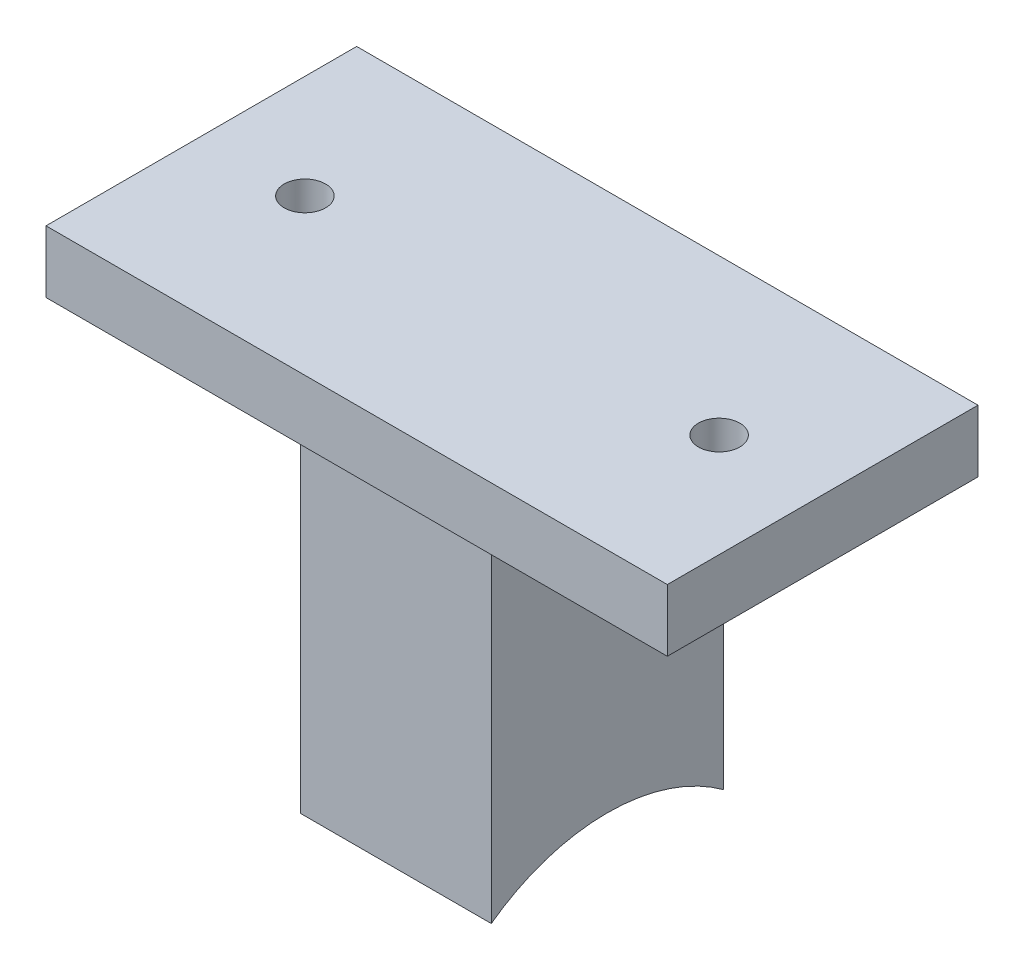
ISO-10303-21;
HEADER;
FILE_DESCRIPTION(('STEP AP214'),'2;1');
FILE_NAME('part.step','',(''),(''),'','','');
FILE_SCHEMA(('AUTOMOTIVE_DESIGN { 1 0 10303 214 1 1 1 1 }'));
ENDSEC;
DATA;
#1=APPLICATION_CONTEXT('core data for automotive mechanical design processes');
#2=APPLICATION_PROTOCOL_DEFINITION('international standard','automotive_design',2000,#1);
#3=PRODUCT_CONTEXT('',#1,'mechanical');
#4=PRODUCT('Part','Part','',(#3));
#5=PRODUCT_RELATED_PRODUCT_CATEGORY('part','',(#4));
#6=PRODUCT_DEFINITION_FORMATION('','',#4);
#7=PRODUCT_DEFINITION_CONTEXT('part definition',#1,'design');
#8=PRODUCT_DEFINITION('design','',#6,#7);
#9=PRODUCT_DEFINITION_SHAPE('','',#8);
#10=(LENGTH_UNIT() NAMED_UNIT(*) SI_UNIT(.MILLI.,.METRE.));
#11=(NAMED_UNIT(*) PLANE_ANGLE_UNIT() SI_UNIT($,.RADIAN.));
#12=(NAMED_UNIT(*) SI_UNIT($,.STERADIAN.) SOLID_ANGLE_UNIT());
#13=UNCERTAINTY_MEASURE_WITH_UNIT(LENGTH_MEASURE(1.E-05),#10,'distance_accuracy_value','');
#14=(GEOMETRIC_REPRESENTATION_CONTEXT(3) GLOBAL_UNCERTAINTY_ASSIGNED_CONTEXT((#13)) GLOBAL_UNIT_ASSIGNED_CONTEXT((#10,
#11,#12)) REPRESENTATION_CONTEXT('',''));
#15=CARTESIAN_POINT('',(0.,0.,0.));
#16=DIRECTION('',(0.,0.,1.));
#17=DIRECTION('',(1.,0.,0.));
#18=AXIS2_PLACEMENT_3D('',#15,#16,#17);
#19=CARTESIAN_POINT('',(15.,-25.,0.));
#20=DIRECTION('',(-1.,0.,0.));
#21=DIRECTION('',(0.,0.,1.));
#22=AXIS2_PLACEMENT_3D('',#19,#20,#21);
#23=CYLINDRICAL_SURFACE('',#22,9.5);
#24=CARTESIAN_POINT('',(-4.6,-25.,0.));
#25=DIRECTION('',(-1.,0.,0.));
#26=DIRECTION('',(0.,0.,1.));
#27=AXIS2_PLACEMENT_3D('',#24,#25,#26);
#28=CIRCLE('',#27,9.5);
#29=CARTESIAN_POINT('',(-4.6,-17.3260179828201,5.6));
#30=VERTEX_POINT('',#29);
#31=CARTESIAN_POINT('',(-4.6,-16.2931061795839,3.8));
#32=VERTEX_POINT('',#31);
#33=EDGE_CURVE('E169',#30,#32,#28,.T.);
#34=ORIENTED_EDGE('',*,*,#33,.T.);
#35=DIRECTION('',(-1.,0.,0.));
#36=VECTOR('',#35,1.);
#37=CARTESIAN_POINT('',(15.,-16.2931061795839,3.8));
#38=LINE('',#37,#36);
#39=CARTESIAN_POINT('',(4.6,-16.2931061795839,3.8));
#40=VERTEX_POINT('',#39);
#41=EDGE_CURVE('E60',#32,#40,#38,.F.);
#42=ORIENTED_EDGE('',*,*,#41,.T.);
#43=CARTESIAN_POINT('',(4.6,-25.,0.));
#44=DIRECTION('',(-1.,0.,0.));
#45=DIRECTION('',(0.,0.,1.));
#46=AXIS2_PLACEMENT_3D('',#43,#44,#45);
#47=CIRCLE('',#46,9.5);
#48=CARTESIAN_POINT('',(4.6,-17.3260179828201,5.6));
#49=VERTEX_POINT('',#48);
#50=EDGE_CURVE('E171',#49,#40,#47,.T.);
#51=ORIENTED_EDGE('',*,*,#50,.F.);
#52=DIRECTION('',(-1.,0.,0.));
#53=VECTOR('',#52,1.);
#54=CARTESIAN_POINT('',(15.,-17.3260179828201,5.6));
#55=LINE('',#54,#53);
#56=EDGE_CURVE('E167',#30,#49,#55,.F.);
#57=ORIENTED_EDGE('',*,*,#56,.F.);
#58=EDGE_LOOP('',(#34,#42,#51,#57));
#59=FACE_BOUND('',#58,.T.);
#60=ADVANCED_FACE('F39',(#59),#23,.F.);
#61=CARTESIAN_POINT('',(0.,0.,0.));
#62=DIRECTION('',(0.,-1.,0.));
#63=DIRECTION('',(0.,0.,-1.));
#64=AXIS2_PLACEMENT_3D('',#61,#62,#63);
#65=PLANE('',#64);
#66=DIRECTION('',(0.,0.,-1.));
#67=VECTOR('',#66,1.);
#68=CARTESIAN_POINT('',(-15.,0.,7.5));
#69=LINE('',#68,#67);
#70=CARTESIAN_POINT('',(-15.,0.,7.5));
#71=VERTEX_POINT('',#70);
#72=CARTESIAN_POINT('',(-15.,0.,-7.5));
#73=VERTEX_POINT('',#72);
#74=EDGE_CURVE('E224',#71,#73,#69,.T.);
#75=ORIENTED_EDGE('',*,*,#74,.T.);
#76=DIRECTION('',(1.,0.,0.));
#77=VECTOR('',#76,1.);
#78=CARTESIAN_POINT('',(-15.,0.,-7.5));
#79=LINE('',#78,#77);
#80=CARTESIAN_POINT('',(15.,0.,-7.5));
#81=VERTEX_POINT('',#80);
#82=EDGE_CURVE('E241',#73,#81,#79,.T.);
#83=ORIENTED_EDGE('',*,*,#82,.T.);
#84=DIRECTION('',(0.,0.,-1.));
#85=VECTOR('',#84,1.);
#86=CARTESIAN_POINT('',(15.,0.,7.5));
#87=LINE('',#86,#85);
#88=CARTESIAN_POINT('',(15.,0.,7.5));
#89=VERTEX_POINT('',#88);
#90=EDGE_CURVE('E244',#89,#81,#87,.T.);
#91=ORIENTED_EDGE('',*,*,#90,.F.);
#92=DIRECTION('',(1.,0.,0.));
#93=VECTOR('',#92,1.);
#94=CARTESIAN_POINT('',(-15.,0.,7.5));
#95=LINE('',#94,#93);
#96=EDGE_CURVE('E231',#71,#89,#95,.T.);
#97=ORIENTED_EDGE('',*,*,#96,.F.);
#98=EDGE_LOOP('',(#75,#83,#91,#97));
#99=FACE_BOUND('',#98,.T.);
#100=CARTESIAN_POINT('',(10.,0.,0.));
#101=DIRECTION('',(0.,-1.,0.));
#102=DIRECTION('',(0.,0.,-1.));
#103=AXIS2_PLACEMENT_3D('',#100,#101,#102);
#104=CIRCLE('',#103,1.5);
#105=CARTESIAN_POINT('',(10.,0.,-1.5));
#106=VERTEX_POINT('',#105);
#107=EDGE_CURVE('E216',#106,#106,#104,.T.);
#108=ORIENTED_EDGE('',*,*,#107,.F.);
#109=EDGE_LOOP('',(#108));
#110=FACE_BOUND('',#109,.T.);
#111=CARTESIAN_POINT('',(-10.,0.,0.));
#112=DIRECTION('',(0.,-1.,0.));
#113=DIRECTION('',(0.,0.,-1.));
#114=AXIS2_PLACEMENT_3D('',#111,#112,#113);
#115=CIRCLE('',#114,1.5);
#116=CARTESIAN_POINT('',(-10.,0.,-1.5));
#117=VERTEX_POINT('',#116);
#118=EDGE_CURVE('E206',#117,#117,#115,.T.);
#119=ORIENTED_EDGE('',*,*,#118,.F.);
#120=EDGE_LOOP('',(#119));
#121=FACE_BOUND('',#120,.T.);
#122=DIRECTION('',(1.,0.,0.));
#123=VECTOR('',#122,1.);
#124=CARTESIAN_POINT('',(-4.6,0.,-5.6));
#125=LINE('',#124,#123);
#126=CARTESIAN_POINT('',(-4.6,0.,-5.6));
#127=VERTEX_POINT('',#126);
#128=CARTESIAN_POINT('',(4.6,0.,-5.6));
#129=VERTEX_POINT('',#128);
#130=EDGE_CURVE('E466',#127,#129,#125,.T.);
#131=ORIENTED_EDGE('',*,*,#130,.F.);
#132=DIRECTION('',(0.,0.,-1.));
#133=VECTOR('',#132,1.);
#134=CARTESIAN_POINT('',(-4.6,0.,5.6));
#135=LINE('',#134,#133);
#136=CARTESIAN_POINT('',(-4.6,0.,5.6));
#137=VERTEX_POINT('',#136);
#138=EDGE_CURVE('E464',#137,#127,#135,.T.);
#139=ORIENTED_EDGE('',*,*,#138,.F.);
#140=DIRECTION('',(-1.,0.,0.));
#141=VECTOR('',#140,1.);
#142=CARTESIAN_POINT('',(-4.6,0.,5.6));
#143=LINE('',#142,#141);
#144=CARTESIAN_POINT('',(4.6,0.,5.6));
#145=VERTEX_POINT('',#144);
#146=EDGE_CURVE('E189',#145,#137,#143,.T.);
#147=ORIENTED_EDGE('',*,*,#146,.F.);
#148=DIRECTION('',(0.,0.,1.));
#149=VECTOR('',#148,1.);
#150=CARTESIAN_POINT('',(4.6,0.,5.6));
#151=LINE('',#150,#149);
#152=EDGE_CURVE('E195',#129,#145,#151,.T.);
#153=ORIENTED_EDGE('',*,*,#152,.F.);
#154=EDGE_LOOP('',(#131,#139,#147,#153));
#155=FACE_BOUND('',#154,.T.);
#156=ADVANCED_FACE('F393',(#99,#110,#121,#155),#65,.T.);
#157=CARTESIAN_POINT('',(10.,3.,0.));
#158=DIRECTION('',(0.,-1.,0.));
#159=DIRECTION('',(0.,0.,-1.));
#160=AXIS2_PLACEMENT_3D('',#157,#158,#159);
#161=CYLINDRICAL_SURFACE('',#160,1.);
#162=CARTESIAN_POINT('',(10.,3.,0.));
#163=DIRECTION('',(0.,-1.,0.));
#164=DIRECTION('',(0.,0.,-1.));
#165=AXIS2_PLACEMENT_3D('',#162,#163,#164);
#166=CIRCLE('',#165,1.);
#167=CARTESIAN_POINT('',(10.,3.,-0.999999999999998));
#168=VERTEX_POINT('',#167);
#169=EDGE_CURVE('E211',#168,#168,#166,.T.);
#170=ORIENTED_EDGE('',*,*,#169,.F.);
#171=EDGE_LOOP('',(#170));
#172=FACE_BOUND('',#171,.T.);
#173=CARTESIAN_POINT('',(10.,1.,0.));
#174=DIRECTION('',(0.,-1.,0.));
#175=DIRECTION('',(0.,0.,-1.));
#176=AXIS2_PLACEMENT_3D('',#173,#174,#175);
#177=CIRCLE('',#176,1.);
#178=CARTESIAN_POINT('',(10.,1.,-0.999999999999998));
#179=VERTEX_POINT('',#178);
#180=EDGE_CURVE('E202',#179,#179,#177,.T.);
#181=ORIENTED_EDGE('',*,*,#180,.T.);
#182=EDGE_LOOP('',(#181));
#183=FACE_BOUND('',#182,.T.);
#184=ADVANCED_FACE('F389',(#172,#183),#161,.F.);
#185=CARTESIAN_POINT('',(-10.,3.,0.));
#186=DIRECTION('',(0.,-1.,0.));
#187=DIRECTION('',(0.,0.,-1.));
#188=AXIS2_PLACEMENT_3D('',#185,#186,#187);
#189=CYLINDRICAL_SURFACE('',#188,1.);
#190=CARTESIAN_POINT('',(-10.,3.,0.));
#191=DIRECTION('',(0.,-1.,0.));
#192=DIRECTION('',(0.,0.,-1.));
#193=AXIS2_PLACEMENT_3D('',#190,#191,#192);
#194=CIRCLE('',#193,1.);
#195=CARTESIAN_POINT('',(-10.,3.,-1.));
#196=VERTEX_POINT('',#195);
#197=EDGE_CURVE('E221',#196,#196,#194,.T.);
#198=ORIENTED_EDGE('',*,*,#197,.F.);
#199=EDGE_LOOP('',(#198));
#200=FACE_BOUND('',#199,.T.);
#201=CARTESIAN_POINT('',(-10.,1.,0.));
#202=DIRECTION('',(0.,-1.,0.));
#203=DIRECTION('',(0.,0.,-1.));
#204=AXIS2_PLACEMENT_3D('',#201,#202,#203);
#205=CIRCLE('',#204,1.);
#206=CARTESIAN_POINT('',(-10.,1.,-1.));
#207=VERTEX_POINT('',#206);
#208=EDGE_CURVE('E203',#207,#207,#205,.T.);
#209=ORIENTED_EDGE('',*,*,#208,.T.);
#210=EDGE_LOOP('',(#209));
#211=FACE_BOUND('',#210,.T.);
#212=ADVANCED_FACE('F385',(#200,#211),#189,.F.);
#213=CARTESIAN_POINT('',(-15.,3.,7.5));
#214=DIRECTION('',(-1.,0.,0.));
#215=DIRECTION('',(0.,0.,1.));
#216=AXIS2_PLACEMENT_3D('',#213,#214,#215);
#217=PLANE('',#216);
#218=ORIENTED_EDGE('',*,*,#74,.F.);
#219=DIRECTION('',(0.,-1.,0.));
#220=VECTOR('',#219,1.);
#221=CARTESIAN_POINT('',(-15.,3.,7.5));
#222=LINE('',#221,#220);
#223=CARTESIAN_POINT('',(-15.,3.,7.5));
#224=VERTEX_POINT('',#223);
#225=EDGE_CURVE('E248',#224,#71,#222,.T.);
#226=ORIENTED_EDGE('',*,*,#225,.F.);
#227=DIRECTION('',(0.,0.,-1.));
#228=VECTOR('',#227,1.);
#229=CARTESIAN_POINT('',(-15.,3.,7.5));
#230=LINE('',#229,#228);
#231=CARTESIAN_POINT('',(-15.,3.,-7.5));
#232=VERTEX_POINT('',#231);
#233=EDGE_CURVE('E227',#224,#232,#230,.T.);
#234=ORIENTED_EDGE('',*,*,#233,.T.);
#235=DIRECTION('',(0.,-1.,0.));
#236=VECTOR('',#235,1.);
#237=CARTESIAN_POINT('',(-15.,3.,-7.5));
#238=LINE('',#237,#236);
#239=EDGE_CURVE('E238',#232,#73,#238,.T.);
#240=ORIENTED_EDGE('',*,*,#239,.T.);
#241=EDGE_LOOP('',(#218,#226,#234,#240));
#242=FACE_BOUND('',#241,.T.);
#243=ADVANCED_FACE('F388',(#242),#217,.T.);
#244=CARTESIAN_POINT('',(-15.,3.,7.5));
#245=DIRECTION('',(0.,0.,-1.));
#246=DIRECTION('',(-1.,0.,0.));
#247=AXIS2_PLACEMENT_3D('',#244,#245,#246);
#248=PLANE('',#247);
#249=ORIENTED_EDGE('',*,*,#96,.T.);
#250=DIRECTION('',(0.,-1.,0.));
#251=VECTOR('',#250,1.);
#252=CARTESIAN_POINT('',(15.,3.,7.5));
#253=LINE('',#252,#251);
#254=CARTESIAN_POINT('',(15.,3.,7.5));
#255=VERTEX_POINT('',#254);
#256=EDGE_CURVE('E250',#255,#89,#253,.T.);
#257=ORIENTED_EDGE('',*,*,#256,.F.);
#258=DIRECTION('',(1.,0.,0.));
#259=VECTOR('',#258,1.);
#260=CARTESIAN_POINT('',(-15.,3.,7.5));
#261=LINE('',#260,#259);
#262=EDGE_CURVE('E236',#224,#255,#261,.T.);
#263=ORIENTED_EDGE('',*,*,#262,.F.);
#264=ORIENTED_EDGE('',*,*,#225,.T.);
#265=EDGE_LOOP('',(#249,#257,#263,#264));
#266=FACE_BOUND('',#265,.T.);
#267=ADVANCED_FACE('F402',(#266),#248,.F.);
#268=CARTESIAN_POINT('',(15.,3.,7.5));
#269=DIRECTION('',(-1.,0.,0.));
#270=DIRECTION('',(0.,0.,1.));
#271=AXIS2_PLACEMENT_3D('',#268,#269,#270);
#272=PLANE('',#271);
#273=ORIENTED_EDGE('',*,*,#90,.T.);
#274=DIRECTION('',(0.,-1.,0.));
#275=VECTOR('',#274,1.);
#276=CARTESIAN_POINT('',(15.,3.,-7.5));
#277=LINE('',#276,#275);
#278=CARTESIAN_POINT('',(15.,3.,-7.5));
#279=VERTEX_POINT('',#278);
#280=EDGE_CURVE('E253',#279,#81,#277,.T.);
#281=ORIENTED_EDGE('',*,*,#280,.F.);
#282=DIRECTION('',(0.,0.,-1.));
#283=VECTOR('',#282,1.);
#284=CARTESIAN_POINT('',(15.,3.,7.5));
#285=LINE('',#284,#283);
#286=EDGE_CURVE('E234',#255,#279,#285,.T.);
#287=ORIENTED_EDGE('',*,*,#286,.F.);
#288=ORIENTED_EDGE('',*,*,#256,.T.);
#289=EDGE_LOOP('',(#273,#281,#287,#288));
#290=FACE_BOUND('',#289,.T.);
#291=ADVANCED_FACE('F405',(#290),#272,.F.);
#292=CARTESIAN_POINT('',(-15.,3.,-7.5));
#293=DIRECTION('',(0.,0.,-1.));
#294=DIRECTION('',(-1.,0.,0.));
#295=AXIS2_PLACEMENT_3D('',#292,#293,#294);
#296=PLANE('',#295);
#297=ORIENTED_EDGE('',*,*,#82,.F.);
#298=ORIENTED_EDGE('',*,*,#239,.F.);
#299=DIRECTION('',(1.,0.,0.));
#300=VECTOR('',#299,1.);
#301=CARTESIAN_POINT('',(-15.,3.,-7.5));
#302=LINE('',#301,#300);
#303=EDGE_CURVE('E230',#232,#279,#302,.T.);
#304=ORIENTED_EDGE('',*,*,#303,.T.);
#305=ORIENTED_EDGE('',*,*,#280,.T.);
#306=EDGE_LOOP('',(#297,#298,#304,#305));
#307=FACE_BOUND('',#306,.T.);
#308=ADVANCED_FACE('F397',(#307),#296,.T.);
#309=CARTESIAN_POINT('',(0.,3.,0.));
#310=DIRECTION('',(0.,-1.,0.));
#311=DIRECTION('',(0.,0.,-1.));
#312=AXIS2_PLACEMENT_3D('',#309,#310,#311);
#313=PLANE('',#312);
#314=ORIENTED_EDGE('',*,*,#197,.T.);
#315=EDGE_LOOP('',(#314));
#316=FACE_BOUND('',#315,.T.);
#317=ORIENTED_EDGE('',*,*,#169,.T.);
#318=EDGE_LOOP('',(#317));
#319=FACE_BOUND('',#318,.T.);
#320=ORIENTED_EDGE('',*,*,#233,.F.);
#321=ORIENTED_EDGE('',*,*,#262,.T.);
#322=ORIENTED_EDGE('',*,*,#286,.T.);
#323=ORIENTED_EDGE('',*,*,#303,.F.);
#324=EDGE_LOOP('',(#320,#321,#322,#323));
#325=FACE_BOUND('',#324,.T.);
#326=ADVANCED_FACE('F377',(#316,#319,#325),#313,.F.);
#327=CARTESIAN_POINT('',(-10.,1.,0.));
#328=DIRECTION('',(0.,-1.,0.));
#329=DIRECTION('',(0.,0.,-1.));
#330=AXIS2_PLACEMENT_3D('',#327,#328,#329);
#331=CYLINDRICAL_SURFACE('',#330,1.5);
#332=CARTESIAN_POINT('',(-10.,1.,0.));
#333=DIRECTION('',(0.,-1.,0.));
#334=DIRECTION('',(0.,0.,-1.));
#335=AXIS2_PLACEMENT_3D('',#332,#333,#334);
#336=CIRCLE('',#335,1.5);
#337=CARTESIAN_POINT('',(-10.,1.,-1.5));
#338=VERTEX_POINT('',#337);
#339=EDGE_CURVE('E208',#338,#338,#336,.T.);
#340=ORIENTED_EDGE('',*,*,#339,.F.);
#341=EDGE_LOOP('',(#340));
#342=FACE_BOUND('',#341,.T.);
#343=ORIENTED_EDGE('',*,*,#118,.T.);
#344=EDGE_LOOP('',(#343));
#345=FACE_BOUND('',#344,.T.);
#346=ADVANCED_FACE('F373',(#342,#345),#331,.F.);
#347=CARTESIAN_POINT('',(-10.,1.,0.));
#348=DIRECTION('',(0.,-1.,0.));
#349=DIRECTION('',(0.,0.,-1.));
#350=AXIS2_PLACEMENT_3D('',#347,#348,#349);
#351=PLANE('',#350);
#352=ORIENTED_EDGE('',*,*,#208,.F.);
#353=EDGE_LOOP('',(#352));
#354=FACE_BOUND('',#353,.T.);
#355=ORIENTED_EDGE('',*,*,#339,.T.);
#356=EDGE_LOOP('',(#355));
#357=FACE_BOUND('',#356,.T.);
#358=ADVANCED_FACE('F369',(#354,#357),#351,.T.);
#359=CARTESIAN_POINT('',(10.,1.,0.));
#360=DIRECTION('',(0.,-1.,0.));
#361=DIRECTION('',(0.,0.,-1.));
#362=AXIS2_PLACEMENT_3D('',#359,#360,#361);
#363=CYLINDRICAL_SURFACE('',#362,1.5);
#364=CARTESIAN_POINT('',(10.,1.,0.));
#365=DIRECTION('',(0.,-1.,0.));
#366=DIRECTION('',(0.,0.,-1.));
#367=AXIS2_PLACEMENT_3D('',#364,#365,#366);
#368=CIRCLE('',#367,1.5);
#369=CARTESIAN_POINT('',(10.,1.,-1.5));
#370=VERTEX_POINT('',#369);
#371=EDGE_CURVE('E207',#370,#370,#368,.T.);
#372=ORIENTED_EDGE('',*,*,#371,.F.);
#373=EDGE_LOOP('',(#372));
#374=FACE_BOUND('',#373,.T.);
#375=ORIENTED_EDGE('',*,*,#107,.T.);
#376=EDGE_LOOP('',(#375));
#377=FACE_BOUND('',#376,.T.);
#378=ADVANCED_FACE('F372',(#374,#377),#363,.F.);
#379=CARTESIAN_POINT('',(10.,1.,0.));
#380=DIRECTION('',(0.,-1.,0.));
#381=DIRECTION('',(0.,0.,-1.));
#382=AXIS2_PLACEMENT_3D('',#379,#380,#381);
#383=PLANE('',#382);
#384=ORIENTED_EDGE('',*,*,#180,.F.);
#385=EDGE_LOOP('',(#384));
#386=FACE_BOUND('',#385,.T.);
#387=ORIENTED_EDGE('',*,*,#371,.T.);
#388=EDGE_LOOP('',(#387));
#389=FACE_BOUND('',#388,.T.);
#390=ADVANCED_FACE('F368',(#386,#389),#383,.T.);
#391=CARTESIAN_POINT('',(-4.6,-20.,5.6));
#392=DIRECTION('',(1.,0.,0.));
#393=DIRECTION('',(0.,0.,-1.));
#394=AXIS2_PLACEMENT_3D('',#391,#392,#393);
#395=PLANE('',#394);
#396=CARTESIAN_POINT('',(-4.6,-25.,0.));
#397=DIRECTION('',(1.,0.,0.));
#398=DIRECTION('',(0.,0.,-1.));
#399=AXIS2_PLACEMENT_3D('',#396,#397,#398);
#400=CIRCLE('',#399,9.50250156445618);
#401=CARTESIAN_POINT('',(-4.60000000001913,-16.2548518419634,-3.71751525571356));
#402=VERTEX_POINT('',#401);
#403=CARTESIAN_POINT('',(-4.6,-16.2548518419625,3.71751525571391));
#404=VERTEX_POINT('',#403);
#405=EDGE_CURVE('E265',#402,#404,#400,.T.);
#406=ORIENTED_EDGE('',*,*,#405,.T.);
#407=CARTESIAN_POINT('',(-4.6,-14.4600759016016,4.6));
#408=DIRECTION('',(1.,0.,0.));
#409=DIRECTION('',(0.,0.,-1.));
#410=AXIS2_PLACEMENT_3D('',#407,#408,#409);
#411=CIRCLE('',#410,2.);
#412=EDGE_CURVE('E184',#404,#32,#411,.F.);
#413=ORIENTED_EDGE('',*,*,#412,.T.);
#414=ORIENTED_EDGE('',*,*,#33,.F.);
#415=DIRECTION('',(0.,1.,0.));
#416=VECTOR('',#415,1.);
#417=CARTESIAN_POINT('',(-4.6,-20.,5.6));
#418=LINE('',#417,#416);
#419=EDGE_CURVE('E182',#30,#137,#418,.T.);
#420=ORIENTED_EDGE('',*,*,#419,.T.);
#421=ORIENTED_EDGE('',*,*,#138,.T.);
#422=DIRECTION('',(0.,1.,0.));
#423=VECTOR('',#422,1.);
#424=CARTESIAN_POINT('',(-4.6,-20.,-5.6));
#425=LINE('',#424,#423);
#426=CARTESIAN_POINT('',(-4.6,-17.3260179828201,-5.6));
#427=VERTEX_POINT('',#426);
#428=EDGE_CURVE('E200',#427,#127,#425,.T.);
#429=ORIENTED_EDGE('',*,*,#428,.F.);
#430=CARTESIAN_POINT('',(-4.6,-16.2931061795839,-3.8));
#431=VERTEX_POINT('',#430);
#432=EDGE_CURVE('E185',#431,#427,#28,.T.);
#433=ORIENTED_EDGE('',*,*,#432,.F.);
#434=CARTESIAN_POINT('',(-4.6,-14.4600759016016,-4.6));
#435=DIRECTION('',(1.,0.,0.));
#436=DIRECTION('',(0.,0.,-1.));
#437=AXIS2_PLACEMENT_3D('',#434,#435,#436);
#438=CIRCLE('',#437,2.);
#439=EDGE_CURVE('E262',#431,#402,#438,.F.);
#440=ORIENTED_EDGE('',*,*,#439,.T.);
#441=EDGE_LOOP('',(#406,#413,#414,#420,#421,#429,#433,#440));
#442=FACE_BOUND('',#441,.T.);
#443=ADVANCED_FACE('F180',(#442),#395,.F.);
#444=CARTESIAN_POINT('',(-4.6,-20.,-5.6));
#445=DIRECTION('',(0.,0.,1.));
#446=DIRECTION('',(1.,0.,0.));
#447=AXIS2_PLACEMENT_3D('',#444,#445,#446);
#448=PLANE('',#447);
#449=DIRECTION('',(0.,1.,0.));
#450=VECTOR('',#449,1.);
#451=CARTESIAN_POINT('',(4.6,-20.,-5.6));
#452=LINE('',#451,#450);
#453=CARTESIAN_POINT('',(4.6,-17.3260179828201,-5.6));
#454=VERTEX_POINT('',#453);
#455=EDGE_CURVE('E193',#454,#129,#452,.T.);
#456=ORIENTED_EDGE('',*,*,#455,.F.);
#457=DIRECTION('',(-1.,0.,0.));
#458=VECTOR('',#457,1.);
#459=CARTESIAN_POINT('',(15.,-17.3260179828201,-5.6));
#460=LINE('',#459,#458);
#461=EDGE_CURVE('E442',#454,#427,#460,.T.);
#462=ORIENTED_EDGE('',*,*,#461,.T.);
#463=ORIENTED_EDGE('',*,*,#428,.T.);
#464=ORIENTED_EDGE('',*,*,#130,.T.);
#465=EDGE_LOOP('',(#456,#462,#463,#464));
#466=FACE_BOUND('',#465,.T.);
#467=ADVANCED_FACE('F361',(#466),#448,.F.);
#468=CARTESIAN_POINT('',(4.6,-20.,5.6));
#469=DIRECTION('',(-1.,0.,0.));
#470=DIRECTION('',(0.,0.,1.));
#471=AXIS2_PLACEMENT_3D('',#468,#469,#470);
#472=PLANE('',#471);
#473=CARTESIAN_POINT('',(4.6,-25.,0.));
#474=DIRECTION('',(-1.,0.,0.));
#475=DIRECTION('',(0.,0.,1.));
#476=AXIS2_PLACEMENT_3D('',#473,#474,#475);
#477=CIRCLE('',#476,9.50250156445618);
#478=CARTESIAN_POINT('',(4.60000000001911,-16.2548518419634,3.71751525571355));
#479=VERTEX_POINT('',#478);
#480=CARTESIAN_POINT('',(4.6,-16.2548518419625,-3.71751525571399));
#481=VERTEX_POINT('',#480);
#482=EDGE_CURVE('E274',#479,#481,#477,.T.);
#483=ORIENTED_EDGE('',*,*,#482,.T.);
#484=CARTESIAN_POINT('',(4.6,-14.4600759016016,-4.6));
#485=DIRECTION('',(-1.,0.,0.));
#486=DIRECTION('',(0.,0.,1.));
#487=AXIS2_PLACEMENT_3D('',#484,#485,#486);
#488=CIRCLE('',#487,2.);
#489=CARTESIAN_POINT('',(4.6,-16.2931061795839,-3.8));
#490=VERTEX_POINT('',#489);
#491=EDGE_CURVE('E277',#481,#490,#488,.F.);
#492=ORIENTED_EDGE('',*,*,#491,.T.);
#493=EDGE_CURVE('E175',#490,#454,#47,.T.);
#494=ORIENTED_EDGE('',*,*,#493,.T.);
#495=ORIENTED_EDGE('',*,*,#455,.T.);
#496=ORIENTED_EDGE('',*,*,#152,.T.);
#497=DIRECTION('',(0.,1.,0.));
#498=VECTOR('',#497,1.);
#499=CARTESIAN_POINT('',(4.6,-20.,5.6));
#500=LINE('',#499,#498);
#501=EDGE_CURVE('E191',#49,#145,#500,.T.);
#502=ORIENTED_EDGE('',*,*,#501,.F.);
#503=ORIENTED_EDGE('',*,*,#50,.T.);
#504=CARTESIAN_POINT('',(4.6,-14.4600759016016,4.6));
#505=DIRECTION('',(-1.,0.,0.));
#506=DIRECTION('',(0.,0.,1.));
#507=AXIS2_PLACEMENT_3D('',#504,#505,#506);
#508=CIRCLE('',#507,2.);
#509=EDGE_CURVE('E271',#40,#479,#508,.F.);
#510=ORIENTED_EDGE('',*,*,#509,.T.);
#511=EDGE_LOOP('',(#483,#492,#494,#495,#496,#502,#503,#510));
#512=FACE_BOUND('',#511,.T.);
#513=ADVANCED_FACE('F358',(#512),#472,.F.);
#514=CARTESIAN_POINT('',(-4.6,-20.,5.6));
#515=DIRECTION('',(0.,0.,-1.));
#516=DIRECTION('',(-1.,0.,0.));
#517=AXIS2_PLACEMENT_3D('',#514,#515,#516);
#518=PLANE('',#517);
#519=ORIENTED_EDGE('',*,*,#419,.F.);
#520=ORIENTED_EDGE('',*,*,#56,.T.);
#521=ORIENTED_EDGE('',*,*,#501,.T.);
#522=ORIENTED_EDGE('',*,*,#146,.T.);
#523=EDGE_LOOP('',(#519,#520,#521,#522));
#524=FACE_BOUND('',#523,.T.);
#525=ADVANCED_FACE('F187',(#524),#518,.F.);
#526=DIRECTION('',(-1.,0.,0.));
#527=VECTOR('',#526,1.);
#528=CARTESIAN_POINT('',(15.,-16.2931061795839,-3.8));
#529=LINE('',#528,#527);
#530=EDGE_CURVE('E257',#490,#431,#529,.T.);
#531=ORIENTED_EDGE('',*,*,#530,.T.);
#532=ORIENTED_EDGE('',*,*,#432,.T.);
#533=ORIENTED_EDGE('',*,*,#461,.F.);
#534=ORIENTED_EDGE('',*,*,#493,.F.);
#535=EDGE_LOOP('',(#531,#532,#533,#534));
#536=FACE_BOUND('',#535,.T.);
#537=ADVANCED_FACE('F328',(#536),#23,.F.);
#538=DIRECTION('',(0.,0.,1.));
#539=VECTOR('',#538,1.);
#540=CARTESIAN_POINT('',(2.7,0.,-2.6));
#541=LINE('',#540,#539);
#542=CARTESIAN_POINT('',(2.7,0.,-2.6));
#543=VERTEX_POINT('',#542);
#544=CARTESIAN_POINT('',(2.7,0.,2.6));
#545=VERTEX_POINT('',#544);
#546=EDGE_CURVE('E444',#543,#545,#541,.T.);
#547=ORIENTED_EDGE('',*,*,#546,.T.);
#548=DIRECTION('',(-1.,0.,0.));
#549=VECTOR('',#548,1.);
#550=CARTESIAN_POINT('',(-2.7,0.,2.6));
#551=LINE('',#550,#549);
#552=CARTESIAN_POINT('',(-2.7,0.,2.6));
#553=VERTEX_POINT('',#552);
#554=EDGE_CURVE('E447',#545,#553,#551,.T.);
#555=ORIENTED_EDGE('',*,*,#554,.T.);
#556=DIRECTION('',(0.,0.,-1.));
#557=VECTOR('',#556,1.);
#558=CARTESIAN_POINT('',(-2.7,0.,-2.6));
#559=LINE('',#558,#557);
#560=CARTESIAN_POINT('',(-2.7,0.,-2.6));
#561=VERTEX_POINT('',#560);
#562=EDGE_CURVE('E450',#553,#561,#559,.T.);
#563=ORIENTED_EDGE('',*,*,#562,.T.);
#564=DIRECTION('',(1.,0.,0.));
#565=VECTOR('',#564,1.);
#566=CARTESIAN_POINT('',(-2.7,0.,-2.6));
#567=LINE('',#566,#565);
#568=EDGE_CURVE('E453',#561,#543,#567,.T.);
#569=ORIENTED_EDGE('',*,*,#568,.T.);
#570=EDGE_LOOP('',(#547,#555,#563,#569));
#571=FACE_BOUND('',#570,.T.);
#572=ADVANCED_FACE('F326',(#571),#65,.T.);
#573=CARTESIAN_POINT('',(-2.7,-20.,-2.6));
#574=DIRECTION('',(0.,0.,1.));
#575=DIRECTION('',(1.,0.,0.));
#576=AXIS2_PLACEMENT_3D('',#573,#574,#575);
#577=PLANE('',#576);
#578=DIRECTION('',(0.,1.,0.));
#579=VECTOR('',#578,1.);
#580=CARTESIAN_POINT('',(-2.7,-20.,-2.6));
#581=LINE('',#580,#579);
#582=CARTESIAN_POINT('',(-2.7,-13.7977680795299,-2.6));
#583=VERTEX_POINT('',#582);
#584=EDGE_CURVE('E458',#583,#561,#581,.T.);
#585=ORIENTED_EDGE('',*,*,#584,.F.);
#586=CARTESIAN_POINT('',(-2.7,-13.7977680795299,-2.6));
#587=CARTESIAN_POINT('',(-2.69999600804059,-13.8540870609309,-2.6));
#588=CARTESIAN_POINT('',(-2.7022572607373,-13.9104047505056,-2.6));
#589=CARTESIAN_POINT('',(-2.71124096611712,-14.0223253673724,-2.6));
#590=CARTESIAN_POINT('',(-2.71793516824398,-14.0779305624729,-2.6));
#591=CARTESIAN_POINT('',(-2.73571644315342,-14.1884327831449,-2.6));
#592=CARTESIAN_POINT('',(-2.74680341961077,-14.2433298242178,-2.6));
#593=CARTESIAN_POINT('',(-2.77338010604683,-14.3524172190988,-2.6));
#594=CARTESIAN_POINT('',(-2.78889733598649,-14.4066008686753,-2.6));
#595=CARTESIAN_POINT('',(-2.80656352678688,-14.4600759016016,-2.6));
#596=B_SPLINE_CURVE_WITH_KNOTS('',3,(#586,#587,#588,#589,#590,#591,#592,#593,#594,#595),
.UNSPECIFIED.,.F.,.F.,(4,2,2,2,4),(0.,0.168909618063766,0.336753027055376,0.504592755762712,
0.673498647081827),.UNSPECIFIED.);
#597=CARTESIAN_POINT('',(-2.80656352678687,-14.4600759016016,-2.6));
#598=VERTEX_POINT('',#597);
#599=EDGE_CURVE('E307',#583,#598,#596,.T.);
#600=ORIENTED_EDGE('',*,*,#599,.T.);
#601=DIRECTION('',(1.,0.,0.));
#602=VECTOR('',#601,1.);
#603=CARTESIAN_POINT('',(2.7,-14.4600759016016,-2.6));
#604=LINE('',#603,#602);
#605=CARTESIAN_POINT('',(2.80656352678687,-14.4600759016016,-2.6));
#606=VERTEX_POINT('',#605);
#607=EDGE_CURVE('E259',#598,#606,#604,.T.);
#608=ORIENTED_EDGE('',*,*,#607,.T.);
#609=CARTESIAN_POINT('',(2.80656352678687,-14.4600759016016,-2.6));
#610=CARTESIAN_POINT('',(2.78889733598649,-14.4066008686753,-2.6));
#611=CARTESIAN_POINT('',(2.77338010604682,-14.3524172190988,-2.6));
#612=CARTESIAN_POINT('',(2.74680341961078,-14.2433298242178,-2.6));
#613=CARTESIAN_POINT('',(2.73571644315342,-14.1884327831449,-2.6));
#614=CARTESIAN_POINT('',(2.71793516824398,-14.0779305624729,-2.6));
#615=CARTESIAN_POINT('',(2.71124096611712,-14.0223253673724,-2.6));
#616=CARTESIAN_POINT('',(2.7022572607373,-13.9104047505056,-2.6));
#617=CARTESIAN_POINT('',(2.69999600804059,-13.8540870609309,-2.6));
#618=CARTESIAN_POINT('',(2.7,-13.7977680795299,-2.6));
#619=B_SPLINE_CURVE_WITH_KNOTS('',3,(#609,#610,#611,#612,#613,#614,#615,#616,#617,#618),
.UNSPECIFIED.,.F.,.F.,(4,2,2,2,4),(0.,0.168905891319114,0.336745620026447,0.504589029018059,
0.673498647081822),.UNSPECIFIED.);
#620=CARTESIAN_POINT('',(2.7,-13.7977680795299,-2.6));
#621=VERTEX_POINT('',#620);
#622=EDGE_CURVE('E331',#606,#621,#619,.T.);
#623=ORIENTED_EDGE('',*,*,#622,.T.);
#624=DIRECTION('',(0.,1.,0.));
#625=VECTOR('',#624,1.);
#626=CARTESIAN_POINT('',(2.7,-20.,-2.6));
#627=LINE('',#626,#625);
#628=EDGE_CURVE('E456',#621,#543,#627,.T.);
#629=ORIENTED_EDGE('',*,*,#628,.T.);
#630=ORIENTED_EDGE('',*,*,#568,.F.);
#631=EDGE_LOOP('',(#585,#600,#608,#623,#629,#630));
#632=FACE_BOUND('',#631,.T.);
#633=ADVANCED_FACE('F320',(#632),#577,.T.);
#634=CARTESIAN_POINT('',(-2.7,-20.,-2.6));
#635=DIRECTION('',(1.,0.,0.));
#636=DIRECTION('',(0.,0.,-1.));
#637=AXIS2_PLACEMENT_3D('',#634,#635,#636);
#638=PLANE('',#637);
#639=DIRECTION('',(0.,1.,0.));
#640=VECTOR('',#639,1.);
#641=CARTESIAN_POINT('',(-2.7,-20.,2.6));
#642=LINE('',#641,#640);
#643=CARTESIAN_POINT('',(-2.7,-13.7977680795299,2.6));
#644=VERTEX_POINT('',#643);
#645=EDGE_CURVE('E460',#644,#553,#642,.T.);
#646=ORIENTED_EDGE('',*,*,#645,.F.);
#647=CARTESIAN_POINT('',(-2.7,-25.,0.));
#648=DIRECTION('',(1.,0.,0.));
#649=DIRECTION('',(0.,0.,-1.));
#650=AXIS2_PLACEMENT_3D('',#647,#648,#649);
#651=CIRCLE('',#650,11.5);
#652=EDGE_CURVE('E268',#644,#583,#651,.F.);
#653=ORIENTED_EDGE('',*,*,#652,.T.);
#654=ORIENTED_EDGE('',*,*,#584,.T.);
#655=ORIENTED_EDGE('',*,*,#562,.F.);
#656=EDGE_LOOP('',(#646,#653,#654,#655));
#657=FACE_BOUND('',#656,.T.);
#658=ADVANCED_FACE('F325',(#657),#638,.T.);
#659=CARTESIAN_POINT('',(-2.7,-20.,2.6));
#660=DIRECTION('',(0.,0.,-1.));
#661=DIRECTION('',(-1.,0.,0.));
#662=AXIS2_PLACEMENT_3D('',#659,#660,#661);
#663=PLANE('',#662);
#664=DIRECTION('',(0.,1.,0.));
#665=VECTOR('',#664,1.);
#666=CARTESIAN_POINT('',(2.7,-20.,2.6));
#667=LINE('',#666,#665);
#668=CARTESIAN_POINT('',(2.7,-13.7977680795299,2.6));
#669=VERTEX_POINT('',#668);
#670=EDGE_CURVE('E462',#669,#545,#667,.T.);
#671=ORIENTED_EDGE('',*,*,#670,.F.);
#672=CARTESIAN_POINT('',(2.7,-13.7977680795299,2.6));
#673=CARTESIAN_POINT('',(2.69999600804059,-13.8540870609309,2.6));
#674=CARTESIAN_POINT('',(2.7022572607373,-13.9104047505056,2.6));
#675=CARTESIAN_POINT('',(2.71124096611712,-14.0223253673724,2.6));
#676=CARTESIAN_POINT('',(2.71793516824398,-14.0779305624729,2.6));
#677=CARTESIAN_POINT('',(2.73571644315342,-14.1884327831449,2.6));
#678=CARTESIAN_POINT('',(2.74680341961078,-14.2433298242178,2.6));
#679=CARTESIAN_POINT('',(2.77338010604683,-14.3524172190988,2.6));
#680=CARTESIAN_POINT('',(2.7888973359865,-14.4066008686753,2.6));
#681=CARTESIAN_POINT('',(2.80656352678689,-14.4600759016016,2.6));
#682=B_SPLINE_CURVE_WITH_KNOTS('',3,(#672,#673,#674,#675,#676,#677,#678,#679,#680,#681),
.UNSPECIFIED.,.F.,.F.,(4,2,2,2,4),(0.,0.168909618063766,0.336753027055376,0.50459275576271,
0.673498647081829),.UNSPECIFIED.);
#683=CARTESIAN_POINT('',(2.80656352678687,-14.4600759016016,2.6));
#684=VERTEX_POINT('',#683);
#685=EDGE_CURVE('E53',#669,#684,#682,.T.);
#686=ORIENTED_EDGE('',*,*,#685,.T.);
#687=DIRECTION('',(1.,0.,0.));
#688=VECTOR('',#687,1.);
#689=CARTESIAN_POINT('',(-2.7,-14.4600759016016,2.6));
#690=LINE('',#689,#688);
#691=CARTESIAN_POINT('',(-2.80656352678687,-14.4600759016016,2.6));
#692=VERTEX_POINT('',#691);
#693=EDGE_CURVE('E67',#684,#692,#690,.F.);
#694=ORIENTED_EDGE('',*,*,#693,.T.);
#695=CARTESIAN_POINT('',(-2.80656352678687,-14.4600759016016,2.6));
#696=CARTESIAN_POINT('',(-2.78889733598649,-14.4066008686753,2.6));
#697=CARTESIAN_POINT('',(-2.77338010604682,-14.3524172190988,2.6));
#698=CARTESIAN_POINT('',(-2.74680341961078,-14.2433298242178,2.6));
#699=CARTESIAN_POINT('',(-2.73571644315342,-14.1884327831449,2.6));
#700=CARTESIAN_POINT('',(-2.71793516824398,-14.0779305624729,2.6));
#701=CARTESIAN_POINT('',(-2.71124096611712,-14.0223253673724,2.6));
#702=CARTESIAN_POINT('',(-2.7022572607373,-13.9104047505056,2.6));
#703=CARTESIAN_POINT('',(-2.69999600804059,-13.8540870609309,2.6));
#704=CARTESIAN_POINT('',(-2.7,-13.7977680795299,2.6));
#705=B_SPLINE_CURVE_WITH_KNOTS('',3,(#695,#696,#697,#698,#699,#700,#701,#702,#703,#704),
.UNSPECIFIED.,.F.,.F.,(4,2,2,2,4),(0.,0.168905891319114,0.336745620026449,0.504589029018061,
0.673498647081824),.UNSPECIFIED.);
#706=EDGE_CURVE('E289',#692,#644,#705,.T.);
#707=ORIENTED_EDGE('',*,*,#706,.T.);
#708=ORIENTED_EDGE('',*,*,#645,.T.);
#709=ORIENTED_EDGE('',*,*,#554,.F.);
#710=EDGE_LOOP('',(#671,#686,#694,#707,#708,#709));
#711=FACE_BOUND('',#710,.T.);
#712=ADVANCED_FACE('F345',(#711),#663,.T.);
#713=CARTESIAN_POINT('',(2.7,-20.,-2.6));
#714=DIRECTION('',(-1.,0.,0.));
#715=DIRECTION('',(0.,0.,1.));
#716=AXIS2_PLACEMENT_3D('',#713,#714,#715);
#717=PLANE('',#716);
#718=ORIENTED_EDGE('',*,*,#628,.F.);
#719=CARTESIAN_POINT('',(2.7,-25.,0.));
#720=DIRECTION('',(-1.,0.,0.));
#721=DIRECTION('',(0.,0.,1.));
#722=AXIS2_PLACEMENT_3D('',#719,#720,#721);
#723=CIRCLE('',#722,11.5);
#724=EDGE_CURVE('E280',#621,#669,#723,.F.);
#725=ORIENTED_EDGE('',*,*,#724,.T.);
#726=ORIENTED_EDGE('',*,*,#670,.T.);
#727=ORIENTED_EDGE('',*,*,#546,.F.);
#728=EDGE_LOOP('',(#718,#725,#726,#727));
#729=FACE_BOUND('',#728,.T.);
#730=ADVANCED_FACE('F349',(#729),#717,.T.);
#731=CARTESIAN_POINT('',(15.,-14.4600759016016,-4.6));
#732=DIRECTION('',(-1.,0.,0.));
#733=DIRECTION('',(0.,0.,1.));
#734=AXIS2_PLACEMENT_3D('',#731,#732,#733);
#735=CYLINDRICAL_SURFACE('',#734,2.);
#736=ORIENTED_EDGE('',*,*,#530,.F.);
#737=ORIENTED_EDGE('',*,*,#491,.F.);
#738=CARTESIAN_POINT('',(2.80656352678687,-14.4600759016016,-2.6));
#739=CARTESIAN_POINT('',(2.8244362727295,-14.5142101287321,-2.59999601841668));
#740=CARTESIAN_POINT('',(2.84433344303072,-14.5676043808212,-2.60219751256789));
#741=CARTESIAN_POINT('',(2.8876937095346,-14.6724721334953,-2.61061698757902));
#742=CARTESIAN_POINT('',(2.91114910846105,-14.7239494884083,-2.61682639056161));
#743=CARTESIAN_POINT('',(2.98559772156938,-14.8738567256285,-2.64068042699116));
#744=CARTESIAN_POINT('',(3.04116924468769,-14.9692066914619,-2.6635725552835));
#745=CARTESIAN_POINT('',(3.17850037487986,-15.1761470838442,-2.7285883601567));
#746=CARTESIAN_POINT('',(3.26320330923689,-15.284576638533,-2.77434079916198));
#747=CARTESIAN_POINT('',(3.44286976139144,-15.4861937471781,-2.87950472760699));
#748=CARTESIAN_POINT('',(3.53789909471539,-15.5792727147433,-2.93900692606668));
#749=CARTESIAN_POINT('',(3.70780990708921,-15.7273609174905,-3.05076844612637));
#750=CARTESIAN_POINT('',(3.78124739505717,-15.7858805185606,-3.10068058341658));
#751=CARTESIAN_POINT('',(3.93054669547387,-15.8953329835005,-3.20509442570197));
#752=CARTESIAN_POINT('',(4.00640979478166,-15.9462617362792,-3.25959859284246));
#753=CARTESIAN_POINT('',(4.15953396469715,-16.0407084175544,-3.37240116650925));
#754=CARTESIAN_POINT('',(4.23679134202015,-16.0842434356598,-3.43069038074574));
#755=CARTESIAN_POINT('',(4.39219716390759,-16.164252595526,-3.55072342493935));
#756=CARTESIAN_POINT('',(4.47034513292133,-16.2007303343292,-3.61246547421579));
#757=CARTESIAN_POINT('',(4.59685858011037,-16.2540354526075,-3.7147663835121));
#758=CARTESIAN_POINT('',(4.64512033181999,-16.27302505188,-3.75434076337732));
#759=CARTESIAN_POINT('',(4.69558742088587,-16.2914991890898,-3.7963254646913));
#760=CARTESIAN_POINT('',(4.6977937145114,-16.2923040671849,-3.79816213284656));
#761=CARTESIAN_POINT('',(4.7,-16.2931061795839,-3.8));
#762=B_SPLINE_CURVE_WITH_KNOTS('',3,(#738,#739,#740,#741,#742,#743,#744,#745,#746,#747,#748,
#749,#750,#751,#752,#753,#754,#755,#756,#757,#758,#759,#760,#761),.UNSPECIFIED.,.F.,.F.,(4,2,2,
2,2,2,2,2,2,2,2,4),(0.,0.170833372172897,0.341302327268685,0.677732399023269,1.11043764728553,
1.54608340169294,1.86471862208241,2.18352578839298,2.5015857393157,2.81948314789075,
3.01513139847552,3.02407567496163),.UNSPECIFIED.);
#763=EDGE_CURVE('E336',#481,#606,#762,.F.);
#764=ORIENTED_EDGE('',*,*,#763,.T.);
#765=ORIENTED_EDGE('',*,*,#607,.F.);
#766=CARTESIAN_POINT('',(-2.80656352678687,-14.4600759016016,-2.6));
#767=CARTESIAN_POINT('',(-2.8244362727295,-14.5142101287321,-2.59999601841668));
#768=CARTESIAN_POINT('',(-2.84433344303072,-14.5676043808212,-2.60219751256789));
#769=CARTESIAN_POINT('',(-2.88769370953459,-14.6724721334953,-2.61061698757902));
#770=CARTESIAN_POINT('',(-2.91114910846105,-14.7239494884083,-2.61682639056161));
#771=CARTESIAN_POINT('',(-2.98559772156938,-14.8738567256285,-2.64068042699116));
#772=CARTESIAN_POINT('',(-3.04116924468769,-14.9692066914619,-2.6635725552835));
#773=CARTESIAN_POINT('',(-3.17850037487986,-15.1761470838442,-2.7285883601567));
#774=CARTESIAN_POINT('',(-3.26320330923689,-15.284576638533,-2.77434079916198));
#775=CARTESIAN_POINT('',(-3.44286976139143,-15.4861937471781,-2.87950472760699));
#776=CARTESIAN_POINT('',(-3.53789909471539,-15.5792727147433,-2.93900692606668));
#777=CARTESIAN_POINT('',(-3.70780990708921,-15.7273609174905,-3.05076844612637));
#778=CARTESIAN_POINT('',(-3.78124739505717,-15.7858805185606,-3.10068058341658));
#779=CARTESIAN_POINT('',(-3.93054669547387,-15.8953329835005,-3.20509442570197));
#780=CARTESIAN_POINT('',(-4.00640979478166,-15.9462617362792,-3.25959859284246));
#781=CARTESIAN_POINT('',(-4.15953396469715,-16.0407084175544,-3.37240116650925));
#782=CARTESIAN_POINT('',(-4.23679134202015,-16.0842434356598,-3.43069038074574));
#783=CARTESIAN_POINT('',(-4.39219716390759,-16.164252595526,-3.55072342493935));
#784=CARTESIAN_POINT('',(-4.47034513292132,-16.2007303343292,-3.61246547421579));
#785=CARTESIAN_POINT('',(-4.59685858011037,-16.2540354526075,-3.7147663835121));
#786=CARTESIAN_POINT('',(-4.64512033181999,-16.27302505188,-3.75434076337732));
#787=CARTESIAN_POINT('',(-4.69558742088587,-16.2914991890898,-3.7963254646913));
#788=CARTESIAN_POINT('',(-4.69779371451139,-16.2923040671849,-3.79816213284656));
#789=CARTESIAN_POINT('',(-4.7,-16.2931061795839,-3.8));
#790=B_SPLINE_CURVE_WITH_KNOTS('',3,(#766,#767,#768,#769,#770,#771,#772,#773,#774,#775,#776,
#777,#778,#779,#780,#781,#782,#783,#784,#785,#786,#787,#788,#789),.UNSPECIFIED.,.F.,.F.,(4,2,2,
2,2,2,2,2,2,2,2,4),(0.,0.170833372172897,0.341302327268685,0.677732399023269,1.11043764728553,
1.54608340169294,1.86471862208241,2.18352578839298,2.5015857393157,2.81948314789075,
3.01513139847552,3.02407567496163),.UNSPECIFIED.);
#791=EDGE_CURVE('E314',#598,#402,#790,.T.);
#792=ORIENTED_EDGE('',*,*,#791,.T.);
#793=ORIENTED_EDGE('',*,*,#439,.F.);
#794=EDGE_LOOP('',(#736,#737,#764,#765,#792,#793));
#795=FACE_BOUND('',#794,.T.);
#796=ADVANCED_FACE('F354',(#795),#735,.T.);
#797=CARTESIAN_POINT('',(15.,-14.4600759016016,4.6));
#798=DIRECTION('',(-1.,0.,0.));
#799=DIRECTION('',(0.,0.,1.));
#800=AXIS2_PLACEMENT_3D('',#797,#798,#799);
#801=CYLINDRICAL_SURFACE('',#800,2.);
#802=ORIENTED_EDGE('',*,*,#41,.F.);
#803=ORIENTED_EDGE('',*,*,#412,.F.);
#804=CARTESIAN_POINT('',(-2.80656352678687,-14.4600759016016,2.6));
#805=CARTESIAN_POINT('',(-2.8244362727295,-14.5142101287321,2.59999601841668));
#806=CARTESIAN_POINT('',(-2.84433344303072,-14.5676043808212,2.6021975125679));
#807=CARTESIAN_POINT('',(-2.88769370953459,-14.6724721334953,2.61061698757902));
#808=CARTESIAN_POINT('',(-2.91114910846105,-14.7239494884083,2.61682639056161));
#809=CARTESIAN_POINT('',(-2.98559772156938,-14.8738567256285,2.64068042699116));
#810=CARTESIAN_POINT('',(-3.04116924468768,-14.9692066914619,2.6635725552835));
#811=CARTESIAN_POINT('',(-3.17850037487986,-15.1761470838442,2.7285883601567));
#812=CARTESIAN_POINT('',(-3.26320330923689,-15.284576638533,2.77434079916198));
#813=CARTESIAN_POINT('',(-3.44286976139144,-15.4861937471781,2.87950472760699));
#814=CARTESIAN_POINT('',(-3.53789909471539,-15.5792727147433,2.93900692606668));
#815=CARTESIAN_POINT('',(-3.70780990708921,-15.7273609174905,3.05076844612637));
#816=CARTESIAN_POINT('',(-3.78124739505717,-15.7858805185606,3.10068058341659));
#817=CARTESIAN_POINT('',(-3.93054669547387,-15.8953329835005,3.20509442570197));
#818=CARTESIAN_POINT('',(-4.00640979478166,-15.9462617362792,3.25959859284246));
#819=CARTESIAN_POINT('',(-4.15953396469714,-16.0407084175544,3.37240116650925));
#820=CARTESIAN_POINT('',(-4.23679134202014,-16.0842434356598,3.43069038074574));
#821=CARTESIAN_POINT('',(-4.39219716390759,-16.164252595526,3.55072342493935));
#822=CARTESIAN_POINT('',(-4.47034513292133,-16.2007303343291,3.61246547421579));
#823=CARTESIAN_POINT('',(-4.59685858011037,-16.2540354526075,3.7147663835121));
#824=CARTESIAN_POINT('',(-4.64512033181998,-16.2730250518801,3.75434076337733));
#825=CARTESIAN_POINT('',(-4.69558742088587,-16.2914991890898,3.7963254646913));
#826=CARTESIAN_POINT('',(-4.69779371451139,-16.2923040671849,3.79816213284657));
#827=CARTESIAN_POINT('',(-4.7,-16.2931061795839,3.8));
#828=B_SPLINE_CURVE_WITH_KNOTS('',3,(#804,#805,#806,#807,#808,#809,#810,#811,#812,#813,#814,
#815,#816,#817,#818,#819,#820,#821,#822,#823,#824,#825,#826,#827),.UNSPECIFIED.,.F.,.F.,(4,2,2,
2,2,2,2,2,2,2,2,4),(0.,0.170833372172893,0.341302327268683,0.67773239902327,1.11043764728553,
1.54608340169294,1.86471862208241,2.18352578839298,2.5015857393157,2.81948314789075,
3.01513139847552,3.02407567496163),.UNSPECIFIED.);
#829=EDGE_CURVE('E283',#404,#692,#828,.F.);
#830=ORIENTED_EDGE('',*,*,#829,.T.);
#831=ORIENTED_EDGE('',*,*,#693,.F.);
#832=CARTESIAN_POINT('',(2.80656352678687,-14.4600759016016,2.6));
#833=CARTESIAN_POINT('',(2.8244362727295,-14.5142101287321,2.59999601841668));
#834=CARTESIAN_POINT('',(2.84433344303072,-14.5676043808212,2.6021975125679));
#835=CARTESIAN_POINT('',(2.88769370953459,-14.6724721334953,2.61061698757902));
#836=CARTESIAN_POINT('',(2.91114910846105,-14.7239494884083,2.61682639056161));
#837=CARTESIAN_POINT('',(2.98559772156938,-14.8738567256285,2.64068042699116));
#838=CARTESIAN_POINT('',(3.04116924468769,-14.9692066914619,2.6635725552835));
#839=CARTESIAN_POINT('',(3.17850037487986,-15.1761470838442,2.7285883601567));
#840=CARTESIAN_POINT('',(3.26320330923689,-15.284576638533,2.77434079916198));
#841=CARTESIAN_POINT('',(3.44286976139144,-15.4861937471781,2.87950472760699));
#842=CARTESIAN_POINT('',(3.53789909471539,-15.5792727147433,2.93900692606668));
#843=CARTESIAN_POINT('',(3.70780990708921,-15.7273609174905,3.05076844612637));
#844=CARTESIAN_POINT('',(3.78124739505717,-15.7858805185606,3.10068058341659));
#845=CARTESIAN_POINT('',(3.93054669547387,-15.8953329835005,3.20509442570197));
#846=CARTESIAN_POINT('',(4.00640979478166,-15.9462617362792,3.25959859284246));
#847=CARTESIAN_POINT('',(4.15953396469715,-16.0407084175544,3.37240116650925));
#848=CARTESIAN_POINT('',(4.23679134202014,-16.0842434356598,3.43069038074574));
#849=CARTESIAN_POINT('',(4.39219716390759,-16.164252595526,3.55072342493935));
#850=CARTESIAN_POINT('',(4.47034513292133,-16.2007303343291,3.61246547421579));
#851=CARTESIAN_POINT('',(4.59685858011037,-16.2540354526075,3.7147663835121));
#852=CARTESIAN_POINT('',(4.64512033181998,-16.2730250518801,3.75434076337733));
#853=CARTESIAN_POINT('',(4.69558742088587,-16.2914991890898,3.7963254646913));
#854=CARTESIAN_POINT('',(4.6977937145114,-16.2923040671849,3.79816213284657));
#855=CARTESIAN_POINT('',(4.7,-16.2931061795839,3.8));
#856=B_SPLINE_CURVE_WITH_KNOTS('',3,(#832,#833,#834,#835,#836,#837,#838,#839,#840,#841,#842,
#843,#844,#845,#846,#847,#848,#849,#850,#851,#852,#853,#854,#855),.UNSPECIFIED.,.F.,.F.,(4,2,2,
2,2,2,2,2,2,2,2,4),(0.,0.170833372172893,0.341302327268683,0.67773239902327,1.11043764728553,
1.54608340169294,1.86471862208241,2.18352578839298,2.5015857393157,2.81948314789075,
3.01513139847552,3.02407567496163),.UNSPECIFIED.);
#857=EDGE_CURVE('E11',#684,#479,#856,.T.);
#858=ORIENTED_EDGE('',*,*,#857,.T.);
#859=ORIENTED_EDGE('',*,*,#509,.F.);
#860=EDGE_LOOP('',(#802,#803,#830,#831,#858,#859));
#861=FACE_BOUND('',#860,.T.);
#862=ADVANCED_FACE('F296',(#861),#801,.T.);
#863=CARTESIAN_POINT('',(-4.7,-25.,0.));
#864=DIRECTION('',(1.,0.,0.));
#865=DIRECTION('',(0.,0.,-1.));
#866=AXIS2_PLACEMENT_3D('',#863,#864,#865);
#867=TOROIDAL_SURFACE('',#866,11.5,2.);
#868=ORIENTED_EDGE('',*,*,#599,.F.);
#869=ORIENTED_EDGE('',*,*,#652,.F.);
#870=ORIENTED_EDGE('',*,*,#706,.F.);
#871=ORIENTED_EDGE('',*,*,#829,.F.);
#872=ORIENTED_EDGE('',*,*,#405,.F.);
#873=ORIENTED_EDGE('',*,*,#791,.F.);
#874=EDGE_LOOP('',(#868,#869,#870,#871,#872,#873));
#875=FACE_BOUND('',#874,.T.);
#876=ADVANCED_FACE('F299',(#875),#867,.T.);
#877=CARTESIAN_POINT('',(4.7,-25.,0.));
#878=DIRECTION('',(-1.,0.,0.));
#879=DIRECTION('',(0.,0.,1.));
#880=AXIS2_PLACEMENT_3D('',#877,#878,#879);
#881=TOROIDAL_SURFACE('',#880,11.5,2.);
#882=ORIENTED_EDGE('',*,*,#685,.F.);
#883=ORIENTED_EDGE('',*,*,#724,.F.);
#884=ORIENTED_EDGE('',*,*,#622,.F.);
#885=ORIENTED_EDGE('',*,*,#763,.F.);
#886=ORIENTED_EDGE('',*,*,#482,.F.);
#887=ORIENTED_EDGE('',*,*,#857,.F.);
#888=EDGE_LOOP('',(#882,#883,#884,#885,#886,#887));
#889=FACE_BOUND('',#888,.T.);
#890=ADVANCED_FACE('F41',(#889),#881,.T.);
#891=CLOSED_SHELL('',(#60,#156,#184,#212,#243,#267,#291,#308,#326,#346,#358,#378,#390,#443,#467,
#513,#525,#537,#572,#633,#658,#712,#730,#796,#862,#876,#890));
#892=MANIFOLD_SOLID_BREP('B2',#891);
#893=ADVANCED_BREP_SHAPE_REPRESENTATION('',(#18,#892),#14);
#894=SHAPE_DEFINITION_REPRESENTATION(#9,#893);
ENDSEC;
END-ISO-10303-21;
